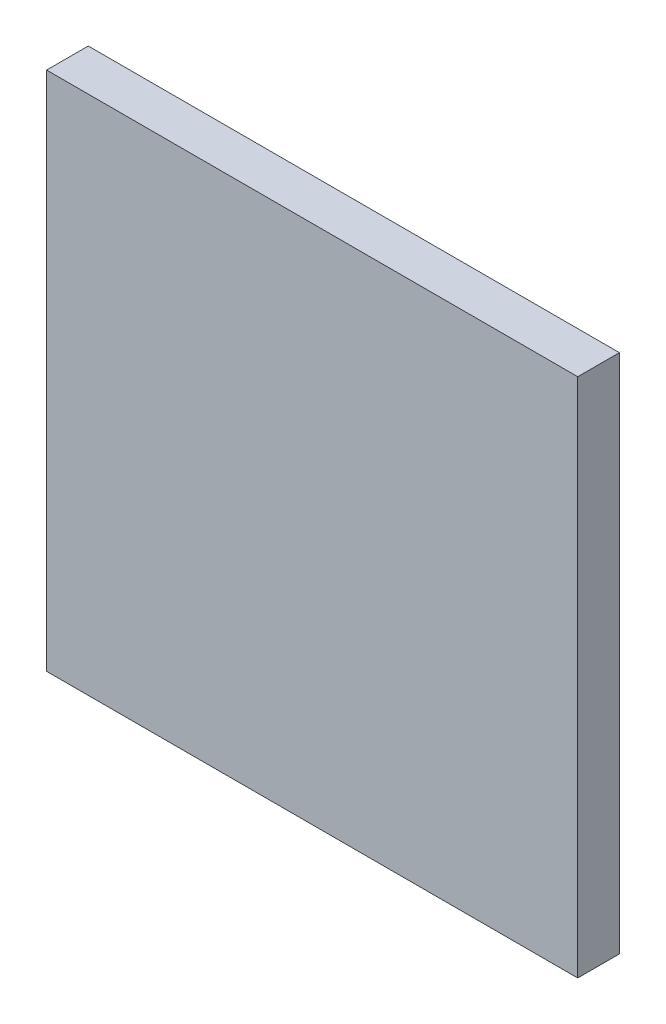
ISO-10303-21;
HEADER;
FILE_DESCRIPTION(('STEP AP214'),'2;1');
FILE_NAME('part.step','',(''),(''),'','','');
FILE_SCHEMA(('AUTOMOTIVE_DESIGN { 1 0 10303 214 1 1 1 1 }'));
ENDSEC;
DATA;
#1=APPLICATION_CONTEXT('core data for automotive mechanical design processes');
#2=APPLICATION_PROTOCOL_DEFINITION('international standard','automotive_design',2000,#1);
#3=PRODUCT_CONTEXT('',#1,'mechanical');
#4=PRODUCT('Part','Part','',(#3));
#5=PRODUCT_RELATED_PRODUCT_CATEGORY('part','',(#4));
#6=PRODUCT_DEFINITION_FORMATION('','',#4);
#7=PRODUCT_DEFINITION_CONTEXT('part definition',#1,'design');
#8=PRODUCT_DEFINITION('design','',#6,#7);
#9=PRODUCT_DEFINITION_SHAPE('','',#8);
#10=(LENGTH_UNIT() NAMED_UNIT(*) SI_UNIT(.MILLI.,.METRE.));
#11=(NAMED_UNIT(*) PLANE_ANGLE_UNIT() SI_UNIT($,.RADIAN.));
#12=(NAMED_UNIT(*) SI_UNIT($,.STERADIAN.) SOLID_ANGLE_UNIT());
#13=UNCERTAINTY_MEASURE_WITH_UNIT(LENGTH_MEASURE(1.E-05),#10,'distance_accuracy_value','');
#14=(GEOMETRIC_REPRESENTATION_CONTEXT(3) GLOBAL_UNCERTAINTY_ASSIGNED_CONTEXT((#13)) GLOBAL_UNIT_ASSIGNED_CONTEXT((#10,
#11,#12)) REPRESENTATION_CONTEXT('',''));
#15=CARTESIAN_POINT('',(0.,0.,0.));
#16=DIRECTION('',(0.,0.,1.));
#17=DIRECTION('',(1.,0.,0.));
#18=AXIS2_PLACEMENT_3D('',#15,#16,#17);
#19=CARTESIAN_POINT('',(127.5,-125.,20.));
#20=DIRECTION('',(-1.,0.,0.));
#21=DIRECTION('',(0.,0.,1.));
#22=AXIS2_PLACEMENT_3D('',#19,#20,#21);
#23=PLANE('',#22);
#24=DIRECTION('',(0.,1.,0.));
#25=VECTOR('',#24,1.);
#26=CARTESIAN_POINT('',(127.5,-125.,0.));
#27=LINE('',#26,#25);
#28=CARTESIAN_POINT('',(127.5,-125.,0.));
#29=VERTEX_POINT('',#28);
#30=CARTESIAN_POINT('',(127.5,125.,0.));
#31=VERTEX_POINT('',#30);
#32=EDGE_CURVE('E96',#29,#31,#27,.T.);
#33=ORIENTED_EDGE('',*,*,#32,.T.);
#34=DIRECTION('',(0.,0.,-1.));
#35=VECTOR('',#34,1.);
#36=CARTESIAN_POINT('',(127.5,125.,20.));
#37=LINE('',#36,#35);
#38=CARTESIAN_POINT('',(127.5,125.,20.));
#39=VERTEX_POINT('',#38);
#40=EDGE_CURVE('E11',#39,#31,#37,.T.);
#41=ORIENTED_EDGE('',*,*,#40,.F.);
#42=DIRECTION('',(0.,1.,0.));
#43=VECTOR('',#42,1.);
#44=CARTESIAN_POINT('',(127.5,-125.,20.));
#45=LINE('',#44,#43);
#46=CARTESIAN_POINT('',(127.5,-125.,20.));
#47=VERTEX_POINT('',#46);
#48=EDGE_CURVE('E84',#47,#39,#45,.T.);
#49=ORIENTED_EDGE('',*,*,#48,.F.);
#50=DIRECTION('',(0.,0.,-1.));
#51=VECTOR('',#50,1.);
#52=CARTESIAN_POINT('',(127.5,-125.,20.));
#53=LINE('',#52,#51);
#54=EDGE_CURVE('E92',#47,#29,#53,.T.);
#55=ORIENTED_EDGE('',*,*,#54,.T.);
#56=EDGE_LOOP('',(#33,#41,#49,#55));
#57=FACE_BOUND('',#56,.T.);
#58=ADVANCED_FACE('F33',(#57),#23,.F.);
#59=CARTESIAN_POINT('',(-127.5,125.,20.));
#60=DIRECTION('',(0.,-1.,0.));
#61=DIRECTION('',(0.,0.,-1.));
#62=AXIS2_PLACEMENT_3D('',#59,#60,#61);
#63=PLANE('',#62);
#64=DIRECTION('',(-1.,0.,0.));
#65=VECTOR('',#64,1.);
#66=CARTESIAN_POINT('',(-127.5,125.,0.));
#67=LINE('',#66,#65);
#68=CARTESIAN_POINT('',(-127.5,125.,0.));
#69=VERTEX_POINT('',#68);
#70=EDGE_CURVE('E88',#31,#69,#67,.T.);
#71=ORIENTED_EDGE('',*,*,#70,.T.);
#72=DIRECTION('',(0.,0.,-1.));
#73=VECTOR('',#72,1.);
#74=CARTESIAN_POINT('',(-127.5,125.,20.));
#75=LINE('',#74,#73);
#76=CARTESIAN_POINT('',(-127.5,125.,20.));
#77=VERTEX_POINT('',#76);
#78=EDGE_CURVE('E41',#77,#69,#75,.T.);
#79=ORIENTED_EDGE('',*,*,#78,.F.);
#80=DIRECTION('',(-1.,0.,0.));
#81=VECTOR('',#80,1.);
#82=CARTESIAN_POINT('',(-127.5,125.,20.));
#83=LINE('',#82,#81);
#84=EDGE_CURVE('E79',#39,#77,#83,.T.);
#85=ORIENTED_EDGE('',*,*,#84,.F.);
#86=ORIENTED_EDGE('',*,*,#40,.T.);
#87=EDGE_LOOP('',(#71,#79,#85,#86));
#88=FACE_BOUND('',#87,.T.);
#89=ADVANCED_FACE('F87',(#88),#63,.F.);
#90=CARTESIAN_POINT('',(-127.5,-125.,20.));
#91=DIRECTION('',(1.,0.,0.));
#92=DIRECTION('',(0.,0.,-1.));
#93=AXIS2_PLACEMENT_3D('',#90,#91,#92);
#94=PLANE('',#93);
#95=DIRECTION('',(0.,-1.,0.));
#96=VECTOR('',#95,1.);
#97=CARTESIAN_POINT('',(-127.5,-125.,0.));
#98=LINE('',#97,#96);
#99=CARTESIAN_POINT('',(-127.5,-125.,0.));
#100=VERTEX_POINT('',#99);
#101=EDGE_CURVE('E66',#69,#100,#98,.T.);
#102=ORIENTED_EDGE('',*,*,#101,.T.);
#103=DIRECTION('',(0.,0.,-1.));
#104=VECTOR('',#103,1.);
#105=CARTESIAN_POINT('',(-127.5,-125.,20.));
#106=LINE('',#105,#104);
#107=CARTESIAN_POINT('',(-127.5,-125.,20.));
#108=VERTEX_POINT('',#107);
#109=EDGE_CURVE('E89',#108,#100,#106,.T.);
#110=ORIENTED_EDGE('',*,*,#109,.F.);
#111=DIRECTION('',(0.,-1.,0.));
#112=VECTOR('',#111,1.);
#113=CARTESIAN_POINT('',(-127.5,-125.,20.));
#114=LINE('',#113,#112);
#115=EDGE_CURVE('E82',#77,#108,#114,.T.);
#116=ORIENTED_EDGE('',*,*,#115,.F.);
#117=ORIENTED_EDGE('',*,*,#78,.T.);
#118=EDGE_LOOP('',(#102,#110,#116,#117));
#119=FACE_BOUND('',#118,.T.);
#120=ADVANCED_FACE('F90',(#119),#94,.F.);
#121=CARTESIAN_POINT('',(-127.5,-125.,20.));
#122=DIRECTION('',(0.,1.,0.));
#123=DIRECTION('',(0.,0.,1.));
#124=AXIS2_PLACEMENT_3D('',#121,#122,#123);
#125=PLANE('',#124);
#126=DIRECTION('',(1.,0.,0.));
#127=VECTOR('',#126,1.);
#128=CARTESIAN_POINT('',(-127.5,-125.,0.));
#129=LINE('',#128,#127);
#130=EDGE_CURVE('E72',#100,#29,#129,.T.);
#131=ORIENTED_EDGE('',*,*,#130,.T.);
#132=ORIENTED_EDGE('',*,*,#54,.F.);
#133=DIRECTION('',(1.,0.,0.));
#134=VECTOR('',#133,1.);
#135=CARTESIAN_POINT('',(-127.5,-125.,20.));
#136=LINE('',#135,#134);
#137=EDGE_CURVE('E49',#108,#47,#136,.T.);
#138=ORIENTED_EDGE('',*,*,#137,.F.);
#139=ORIENTED_EDGE('',*,*,#109,.T.);
#140=EDGE_LOOP('',(#131,#132,#138,#139));
#141=FACE_BOUND('',#140,.T.);
#142=ADVANCED_FACE('F103',(#141),#125,.F.);
#143=CARTESIAN_POINT('',(0.,0.,20.));
#144=DIRECTION('',(0.,0.,-1.));
#145=DIRECTION('',(-1.,0.,0.));
#146=AXIS2_PLACEMENT_3D('',#143,#144,#145);
#147=PLANE('',#146);
#148=ORIENTED_EDGE('',*,*,#48,.T.);
#149=ORIENTED_EDGE('',*,*,#84,.T.);
#150=ORIENTED_EDGE('',*,*,#115,.T.);
#151=ORIENTED_EDGE('',*,*,#137,.T.);
#152=EDGE_LOOP('',(#148,#149,#150,#151));
#153=FACE_BOUND('',#152,.T.);
#154=ADVANCED_FACE('F80',(#153),#147,.F.);
#155=CARTESIAN_POINT('',(0.,0.,0.));
#156=DIRECTION('',(0.,0.,-1.));
#157=DIRECTION('',(-1.,0.,0.));
#158=AXIS2_PLACEMENT_3D('',#155,#156,#157);
#159=PLANE('',#158);
#160=ORIENTED_EDGE('',*,*,#32,.F.);
#161=ORIENTED_EDGE('',*,*,#130,.F.);
#162=ORIENTED_EDGE('',*,*,#101,.F.);
#163=ORIENTED_EDGE('',*,*,#70,.F.);
#164=EDGE_LOOP('',(#160,#161,#162,#163));
#165=FACE_BOUND('',#164,.T.);
#166=ADVANCED_FACE('F106',(#165),#159,.T.);
#167=CLOSED_SHELL('',(#58,#89,#120,#142,#154,#166));
#168=MANIFOLD_SOLID_BREP('B2',#167);
#169=ADVANCED_BREP_SHAPE_REPRESENTATION('',(#18,#168),#14);
#170=SHAPE_DEFINITION_REPRESENTATION(#9,#169);
ENDSEC;
END-ISO-10303-21;
